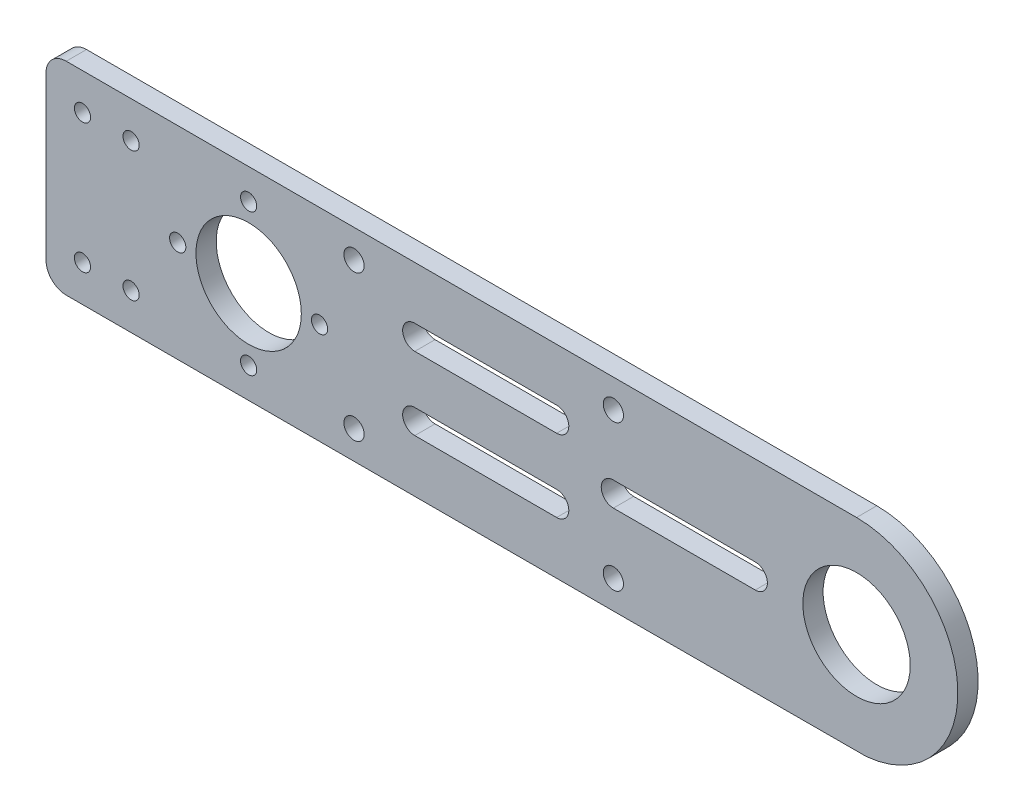
ISO-10303-21;
HEADER;
FILE_DESCRIPTION(('STEP AP214'),'2;1');
FILE_NAME('part.step','',(''),(''),'','','');
FILE_SCHEMA(('AUTOMOTIVE_DESIGN { 1 0 10303 214 1 1 1 1 }'));
ENDSEC;
DATA;
#1=APPLICATION_CONTEXT('core data for automotive mechanical design processes');
#2=APPLICATION_PROTOCOL_DEFINITION('international standard','automotive_design',2000,#1);
#3=PRODUCT_CONTEXT('',#1,'mechanical');
#4=PRODUCT('Part','Part','',(#3));
#5=PRODUCT_RELATED_PRODUCT_CATEGORY('part','',(#4));
#6=PRODUCT_DEFINITION_FORMATION('','',#4);
#7=PRODUCT_DEFINITION_CONTEXT('part definition',#1,'design');
#8=PRODUCT_DEFINITION('design','',#6,#7);
#9=PRODUCT_DEFINITION_SHAPE('','',#8);
#10=(LENGTH_UNIT() NAMED_UNIT(*) SI_UNIT(.MILLI.,.METRE.));
#11=(NAMED_UNIT(*) PLANE_ANGLE_UNIT() SI_UNIT($,.RADIAN.));
#12=(NAMED_UNIT(*) SI_UNIT($,.STERADIAN.) SOLID_ANGLE_UNIT());
#13=UNCERTAINTY_MEASURE_WITH_UNIT(LENGTH_MEASURE(1.E-05),#10,'distance_accuracy_value','');
#14=(GEOMETRIC_REPRESENTATION_CONTEXT(3) GLOBAL_UNCERTAINTY_ASSIGNED_CONTEXT((#13)) GLOBAL_UNIT_ASSIGNED_CONTEXT((#10,
#11,#12)) REPRESENTATION_CONTEXT('',''));
#15=CARTESIAN_POINT('',(0.,0.,0.));
#16=DIRECTION('',(0.,0.,1.));
#17=DIRECTION('',(1.,0.,0.));
#18=AXIS2_PLACEMENT_3D('',#15,#16,#17);
#19=CARTESIAN_POINT('',(184.,0.,5.));
#20=DIRECTION('',(0.,0.,1.));
#21=DIRECTION('',(1.,0.,0.));
#22=AXIS2_PLACEMENT_3D('',#19,#20,#21);
#23=PLANE('',#22);
#24=CARTESIAN_POINT('',(60.,18.,5.));
#25=DIRECTION('',(0.,0.,1.));
#26=DIRECTION('',(1.,0.,0.));
#27=AXIS2_PLACEMENT_3D('',#24,#25,#26);
#28=CIRCLE('',#27,2.50000000000001);
#29=CARTESIAN_POINT('',(62.5,18.,5.));
#30=VERTEX_POINT('',#29);
#31=EDGE_CURVE('E203',#30,#30,#28,.T.);
#32=ORIENTED_EDGE('',*,*,#31,.F.);
#33=EDGE_LOOP('',(#32));
#34=FACE_BOUND('',#33,.T.);
#35=CARTESIAN_POINT('',(16.5000000000002,0.,5.));
#36=DIRECTION('',(0.,0.,1.));
#37=DIRECTION('',(1.,0.,0.));
#38=AXIS2_PLACEMENT_3D('',#35,#36,#37);
#39=CIRCLE('',#38,2.);
#40=CARTESIAN_POINT('',(18.5000000000002,0.,5.));
#41=VERTEX_POINT('',#40);
#42=EDGE_CURVE('E220',#41,#41,#39,.T.);
#43=ORIENTED_EDGE('',*,*,#42,.F.);
#44=EDGE_LOOP('',(#43));
#45=FACE_BOUND('',#44,.T.);
#46=CARTESIAN_POINT('',(5.,16.,5.));
#47=DIRECTION('',(0.,0.,1.));
#48=DIRECTION('',(1.,0.,0.));
#49=AXIS2_PLACEMENT_3D('',#46,#47,#48);
#50=CIRCLE('',#49,2.);
#51=CARTESIAN_POINT('',(7.,16.,5.));
#52=VERTEX_POINT('',#51);
#53=EDGE_CURVE('E263',#52,#52,#50,.T.);
#54=ORIENTED_EDGE('',*,*,#53,.F.);
#55=EDGE_LOOP('',(#54));
#56=FACE_BOUND('',#55,.T.);
#57=DIRECTION('',(1.,0.,0.));
#58=VECTOR('',#57,1.);
#59=CARTESIAN_POINT('',(75.,-12.,5.));
#60=LINE('',#59,#58);
#61=CARTESIAN_POINT('',(75.,-12.,5.));
#62=VERTEX_POINT('',#61);
#63=CARTESIAN_POINT('',(110.,-12.,5.));
#64=VERTEX_POINT('',#63);
#65=EDGE_CURVE('E277',#62,#64,#60,.T.);
#66=ORIENTED_EDGE('',*,*,#65,.F.);
#67=CARTESIAN_POINT('',(75.,-9.,5.));
#68=DIRECTION('',(0.,0.,1.));
#69=DIRECTION('',(-1.,0.,0.));
#70=AXIS2_PLACEMENT_3D('',#67,#68,#69);
#71=CIRCLE('',#70,3.);
#72=CARTESIAN_POINT('',(75.,-6.,5.));
#73=VERTEX_POINT('',#72);
#74=EDGE_CURVE('E275',#73,#62,#71,.T.);
#75=ORIENTED_EDGE('',*,*,#74,.F.);
#76=DIRECTION('',(-1.,0.,0.));
#77=VECTOR('',#76,1.);
#78=CARTESIAN_POINT('',(75.,-6.,5.));
#79=LINE('',#78,#77);
#80=CARTESIAN_POINT('',(110.,-6.,5.));
#81=VERTEX_POINT('',#80);
#82=EDGE_CURVE('E283',#81,#73,#79,.T.);
#83=ORIENTED_EDGE('',*,*,#82,.F.);
#84=CARTESIAN_POINT('',(110.,-9.,5.));
#85=DIRECTION('',(0.,0.,1.));
#86=DIRECTION('',(-1.,0.,0.));
#87=AXIS2_PLACEMENT_3D('',#84,#85,#86);
#88=CIRCLE('',#87,3.);
#89=EDGE_CURVE('E280',#64,#81,#88,.T.);
#90=ORIENTED_EDGE('',*,*,#89,.F.);
#91=EDGE_LOOP('',(#66,#75,#83,#90));
#92=FACE_BOUND('',#91,.T.);
#93=CARTESIAN_POINT('',(60.,-18.,5.));
#94=DIRECTION('',(0.,0.,1.));
#95=DIRECTION('',(-1.,0.,0.));
#96=AXIS2_PLACEMENT_3D('',#93,#94,#95);
#97=CIRCLE('',#96,2.50000000000001);
#98=CARTESIAN_POINT('',(57.5,-18.,5.));
#99=VERTEX_POINT('',#98);
#100=EDGE_CURVE('E306',#99,#99,#97,.T.);
#101=ORIENTED_EDGE('',*,*,#100,.F.);
#102=EDGE_LOOP('',(#101));
#103=FACE_BOUND('',#102,.T.);
#104=CARTESIAN_POINT('',(51.5000000000002,1.80411241501588E-13,5.));
#105=DIRECTION('',(0.,0.,1.));
#106=DIRECTION('',(1.,0.,0.));
#107=AXIS2_PLACEMENT_3D('',#104,#105,#106);
#108=CIRCLE('',#107,2.);
#109=CARTESIAN_POINT('',(53.5000000000002,1.80411241501588E-13,5.));
#110=VERTEX_POINT('',#109);
#111=EDGE_CURVE('E318',#110,#110,#108,.T.);
#112=ORIENTED_EDGE('',*,*,#111,.F.);
#113=EDGE_LOOP('',(#112));
#114=FACE_BOUND('',#113,.T.);
#115=CARTESIAN_POINT('',(124.,-18.,5.));
#116=DIRECTION('',(0.,0.,1.));
#117=DIRECTION('',(-1.,0.,0.));
#118=AXIS2_PLACEMENT_3D('',#115,#116,#117);
#119=CIRCLE('',#118,2.5);
#120=CARTESIAN_POINT('',(121.5,-18.,5.));
#121=VERTEX_POINT('',#120);
#122=EDGE_CURVE('E330',#121,#121,#119,.T.);
#123=ORIENTED_EDGE('',*,*,#122,.F.);
#124=EDGE_LOOP('',(#123));
#125=FACE_BOUND('',#124,.T.);
#126=CARTESIAN_POINT('',(34.,0.,5.));
#127=DIRECTION('',(0.,0.,1.));
#128=DIRECTION('',(1.,0.,0.));
#129=AXIS2_PLACEMENT_3D('',#126,#127,#128);
#130=CIRCLE('',#129,13.);
#131=CARTESIAN_POINT('',(47.,0.,5.));
#132=VERTEX_POINT('',#131);
#133=EDGE_CURVE('E342',#132,#132,#130,.T.);
#134=ORIENTED_EDGE('',*,*,#133,.F.);
#135=EDGE_LOOP('',(#134));
#136=FACE_BOUND('',#135,.T.);
#137=DIRECTION('',(0.,-1.,0.));
#138=VECTOR('',#137,1.);
#139=CARTESIAN_POINT('',(-16.,25.,5.));
#140=LINE('',#139,#138);
#141=CARTESIAN_POINT('',(-16.,20.,5.));
#142=VERTEX_POINT('',#141);
#143=CARTESIAN_POINT('',(-16.,-20.,5.));
#144=VERTEX_POINT('',#143);
#145=EDGE_CURVE('E350',#142,#144,#140,.T.);
#146=ORIENTED_EDGE('',*,*,#145,.T.);
#147=CARTESIAN_POINT('',(-11.,-20.,5.));
#148=DIRECTION('',(0.,0.,1.));
#149=DIRECTION('',(1.,0.,0.));
#150=AXIS2_PLACEMENT_3D('',#147,#148,#149);
#151=CIRCLE('',#150,5.);
#152=CARTESIAN_POINT('',(-11.,-25.,5.));
#153=VERTEX_POINT('',#152);
#154=EDGE_CURVE('E45',#144,#153,#151,.T.);
#155=ORIENTED_EDGE('',*,*,#154,.T.);
#156=DIRECTION('',(1.,0.,0.));
#157=VECTOR('',#156,1.);
#158=CARTESIAN_POINT('',(-16.,-25.,5.));
#159=LINE('',#158,#157);
#160=CARTESIAN_POINT('',(124.869292100737,-25.,5.));
#161=VERTEX_POINT('',#160);
#162=EDGE_CURVE('E353',#153,#161,#159,.T.);
#163=ORIENTED_EDGE('',*,*,#162,.T.);
#164=DIRECTION('',(0.999997963583353,0.00201812515635357,0.));
#165=VECTOR('',#164,1.);
#166=CARTESIAN_POINT('',(124.869292100737,-25.,5.));
#167=LINE('',#166,#165);
#168=CARTESIAN_POINT('',(186.490484141799,-24.8756404689296,5.));
#169=VERTEX_POINT('',#168);
#170=EDGE_CURVE('E355',#161,#169,#167,.T.);
#171=ORIENTED_EDGE('',*,*,#170,.T.);
#172=CARTESIAN_POINT('',(184.,0.,5.));
#173=DIRECTION('',(0.,0.,1.));
#174=DIRECTION('',(1.,0.,0.));
#175=AXIS2_PLACEMENT_3D('',#172,#173,#174);
#176=CIRCLE('',#175,25.);
#177=CARTESIAN_POINT('',(184.,25.,5.));
#178=VERTEX_POINT('',#177);
#179=EDGE_CURVE('E357',#169,#178,#176,.T.);
#180=ORIENTED_EDGE('',*,*,#179,.T.);
#181=DIRECTION('',(-1.,0.,0.));
#182=VECTOR('',#181,1.);
#183=CARTESIAN_POINT('',(0.,25.,5.));
#184=LINE('',#183,#182);
#185=CARTESIAN_POINT('',(-11.,25.,5.));
#186=VERTEX_POINT('',#185);
#187=EDGE_CURVE('E348',#178,#186,#184,.T.);
#188=ORIENTED_EDGE('',*,*,#187,.T.);
#189=CARTESIAN_POINT('',(-11.,20.,5.));
#190=DIRECTION('',(0.,0.,1.));
#191=DIRECTION('',(1.,0.,0.));
#192=AXIS2_PLACEMENT_3D('',#189,#190,#191);
#193=CIRCLE('',#192,5.);
#194=EDGE_CURVE('E389',#186,#142,#193,.T.);
#195=ORIENTED_EDGE('',*,*,#194,.T.);
#196=EDGE_LOOP('',(#146,#155,#163,#171,#180,#188,#195));
#197=FACE_BOUND('',#196,.T.);
#198=CARTESIAN_POINT('',(34.,17.5,5.));
#199=DIRECTION('',(0.,0.,1.));
#200=DIRECTION('',(1.,0.,0.));
#201=AXIS2_PLACEMENT_3D('',#198,#199,#200);
#202=CIRCLE('',#201,2.);
#203=CARTESIAN_POINT('',(36.,17.5,5.));
#204=VERTEX_POINT('',#203);
#205=EDGE_CURVE('E336',#204,#204,#202,.T.);
#206=ORIENTED_EDGE('',*,*,#205,.F.);
#207=EDGE_LOOP('',(#206));
#208=FACE_BOUND('',#207,.T.);
#209=CARTESIAN_POINT('',(-7.,16.,5.));
#210=DIRECTION('',(0.,0.,1.));
#211=DIRECTION('',(1.,0.,0.));
#212=AXIS2_PLACEMENT_3D('',#209,#210,#211);
#213=CIRCLE('',#212,2.);
#214=CARTESIAN_POINT('',(-5.,16.,5.));
#215=VERTEX_POINT('',#214);
#216=EDGE_CURVE('E324',#215,#215,#213,.T.);
#217=ORIENTED_EDGE('',*,*,#216,.F.);
#218=EDGE_LOOP('',(#217));
#219=FACE_BOUND('',#218,.T.);
#220=CARTESIAN_POINT('',(184.,0.,5.));
#221=DIRECTION('',(0.,0.,1.));
#222=DIRECTION('',(1.,0.,0.));
#223=AXIS2_PLACEMENT_3D('',#220,#221,#222);
#224=CIRCLE('',#223,13.25);
#225=CARTESIAN_POINT('',(197.25,0.,5.));
#226=VERTEX_POINT('',#225);
#227=EDGE_CURVE('E312',#226,#226,#224,.T.);
#228=ORIENTED_EDGE('',*,*,#227,.F.);
#229=EDGE_LOOP('',(#228));
#230=FACE_BOUND('',#229,.T.);
#231=CARTESIAN_POINT('',(34.0000000000004,-17.5,5.));
#232=DIRECTION('',(0.,0.,1.));
#233=DIRECTION('',(1.,0.,0.));
#234=AXIS2_PLACEMENT_3D('',#231,#232,#233);
#235=CIRCLE('',#234,2.);
#236=CARTESIAN_POINT('',(36.0000000000004,-17.5,5.));
#237=VERTEX_POINT('',#236);
#238=EDGE_CURVE('E269',#237,#237,#235,.T.);
#239=ORIENTED_EDGE('',*,*,#238,.F.);
#240=EDGE_LOOP('',(#239));
#241=FACE_BOUND('',#240,.T.);
#242=CARTESIAN_POINT('',(5.,-16.,5.));
#243=DIRECTION('',(0.,0.,1.));
#244=DIRECTION('',(-1.,0.,0.));
#245=AXIS2_PLACEMENT_3D('',#242,#243,#244);
#246=CIRCLE('',#245,2.);
#247=CARTESIAN_POINT('',(3.,-16.,5.));
#248=VERTEX_POINT('',#247);
#249=EDGE_CURVE('E257',#248,#248,#246,.T.);
#250=ORIENTED_EDGE('',*,*,#249,.F.);
#251=EDGE_LOOP('',(#250));
#252=FACE_BOUND('',#251,.T.);
#253=DIRECTION('',(1.,0.,0.));
#254=VECTOR('',#253,1.);
#255=CARTESIAN_POINT('',(124.,-3.,5.));
#256=LINE('',#255,#254);
#257=CARTESIAN_POINT('',(124.,-3.,5.));
#258=VERTEX_POINT('',#257);
#259=CARTESIAN_POINT('',(159.,-3.,5.));
#260=VERTEX_POINT('',#259);
#261=EDGE_CURVE('E228',#258,#260,#256,.T.);
#262=ORIENTED_EDGE('',*,*,#261,.F.);
#263=CARTESIAN_POINT('',(124.,0.,5.));
#264=DIRECTION('',(0.,0.,1.));
#265=DIRECTION('',(1.,0.,0.));
#266=AXIS2_PLACEMENT_3D('',#263,#264,#265);
#267=CIRCLE('',#266,3.);
#268=CARTESIAN_POINT('',(124.,3.,5.));
#269=VERTEX_POINT('',#268);
#270=EDGE_CURVE('E226',#269,#258,#267,.T.);
#271=ORIENTED_EDGE('',*,*,#270,.F.);
#272=DIRECTION('',(-1.,0.,0.));
#273=VECTOR('',#272,1.);
#274=CARTESIAN_POINT('',(124.,3.,5.));
#275=LINE('',#274,#273);
#276=CARTESIAN_POINT('',(159.,3.,5.));
#277=VERTEX_POINT('',#276);
#278=EDGE_CURVE('E234',#277,#269,#275,.T.);
#279=ORIENTED_EDGE('',*,*,#278,.F.);
#280=CARTESIAN_POINT('',(159.,0.,5.));
#281=DIRECTION('',(0.,0.,1.));
#282=DIRECTION('',(1.,0.,0.));
#283=AXIS2_PLACEMENT_3D('',#280,#281,#282);
#284=CIRCLE('',#283,3.);
#285=EDGE_CURVE('E231',#260,#277,#284,.T.);
#286=ORIENTED_EDGE('',*,*,#285,.F.);
#287=EDGE_LOOP('',(#262,#271,#279,#286));
#288=FACE_BOUND('',#287,.T.);
#289=CARTESIAN_POINT('',(-7.,-16.,5.));
#290=DIRECTION('',(0.,0.,1.));
#291=DIRECTION('',(-1.,0.,0.));
#292=AXIS2_PLACEMENT_3D('',#289,#290,#291);
#293=CIRCLE('',#292,2.);
#294=CARTESIAN_POINT('',(-9.,-16.,5.));
#295=VERTEX_POINT('',#294);
#296=EDGE_CURVE('E214',#295,#295,#293,.T.);
#297=ORIENTED_EDGE('',*,*,#296,.F.);
#298=EDGE_LOOP('',(#297));
#299=FACE_BOUND('',#298,.T.);
#300=DIRECTION('',(1.,0.,0.));
#301=VECTOR('',#300,1.);
#302=CARTESIAN_POINT('',(75.,6.,5.));
#303=LINE('',#302,#301);
#304=CARTESIAN_POINT('',(75.,6.,5.));
#305=VERTEX_POINT('',#304);
#306=CARTESIAN_POINT('',(110.,6.,5.));
#307=VERTEX_POINT('',#306);
#308=EDGE_CURVE('E180',#305,#307,#303,.T.);
#309=ORIENTED_EDGE('',*,*,#308,.F.);
#310=CARTESIAN_POINT('',(75.,9.,5.));
#311=DIRECTION('',(0.,0.,1.));
#312=DIRECTION('',(1.,0.,0.));
#313=AXIS2_PLACEMENT_3D('',#310,#311,#312);
#314=CIRCLE('',#313,3.);
#315=CARTESIAN_POINT('',(75.,12.,5.));
#316=VERTEX_POINT('',#315);
#317=EDGE_CURVE('E170',#316,#305,#314,.T.);
#318=ORIENTED_EDGE('',*,*,#317,.F.);
#319=DIRECTION('',(-1.,0.,0.));
#320=VECTOR('',#319,1.);
#321=CARTESIAN_POINT('',(75.,12.,5.));
#322=LINE('',#321,#320);
#323=CARTESIAN_POINT('',(110.,12.,5.));
#324=VERTEX_POINT('',#323);
#325=EDGE_CURVE('E196',#324,#316,#322,.T.);
#326=ORIENTED_EDGE('',*,*,#325,.F.);
#327=CARTESIAN_POINT('',(110.,9.,5.));
#328=DIRECTION('',(0.,0.,1.));
#329=DIRECTION('',(1.,0.,0.));
#330=AXIS2_PLACEMENT_3D('',#327,#328,#329);
#331=CIRCLE('',#330,3.);
#332=EDGE_CURVE('E194',#307,#324,#331,.T.);
#333=ORIENTED_EDGE('',*,*,#332,.F.);
#334=EDGE_LOOP('',(#309,#318,#326,#333));
#335=FACE_BOUND('',#334,.T.);
#336=CARTESIAN_POINT('',(124.,18.,5.));
#337=DIRECTION('',(0.,0.,1.));
#338=DIRECTION('',(1.,0.,0.));
#339=AXIS2_PLACEMENT_3D('',#336,#337,#338);
#340=CIRCLE('',#339,2.5);
#341=CARTESIAN_POINT('',(126.5,18.,5.));
#342=VERTEX_POINT('',#341);
#343=EDGE_CURVE('E558',#342,#342,#340,.T.);
#344=ORIENTED_EDGE('',*,*,#343,.F.);
#345=EDGE_LOOP('',(#344));
#346=FACE_BOUND('',#345,.T.);
#347=ADVANCED_FACE('F37',(#34,#45,#56,#92,#103,#114,#125,#136,#197,#208,#219,#230,#241,#252,
#288,#299,#335,#346),#23,.T.);
#348=CARTESIAN_POINT('',(184.,0.,0.));
#349=DIRECTION('',(0.,0.,1.));
#350=DIRECTION('',(1.,0.,0.));
#351=AXIS2_PLACEMENT_3D('',#348,#349,#350);
#352=PLANE('',#351);
#353=CARTESIAN_POINT('',(-7.,-16.,0.));
#354=DIRECTION('',(0.,0.,1.));
#355=DIRECTION('',(-1.,0.,0.));
#356=AXIS2_PLACEMENT_3D('',#353,#354,#355);
#357=CIRCLE('',#356,2.);
#358=CARTESIAN_POINT('',(-9.,-16.,0.));
#359=VERTEX_POINT('',#358);
#360=EDGE_CURVE('E188',#359,#359,#357,.T.);
#361=ORIENTED_EDGE('',*,*,#360,.T.);
#362=EDGE_LOOP('',(#361));
#363=FACE_BOUND('',#362,.T.);
#364=CARTESIAN_POINT('',(16.5000000000002,0.,0.));
#365=DIRECTION('',(0.,0.,1.));
#366=DIRECTION('',(1.,0.,0.));
#367=AXIS2_PLACEMENT_3D('',#364,#365,#366);
#368=CIRCLE('',#367,2.);
#369=CARTESIAN_POINT('',(18.5000000000002,0.,0.));
#370=VERTEX_POINT('',#369);
#371=EDGE_CURVE('E217',#370,#370,#368,.T.);
#372=ORIENTED_EDGE('',*,*,#371,.T.);
#373=EDGE_LOOP('',(#372));
#374=FACE_BOUND('',#373,.T.);
#375=CARTESIAN_POINT('',(124.,0.,0.));
#376=DIRECTION('',(0.,0.,1.));
#377=DIRECTION('',(1.,0.,0.));
#378=AXIS2_PLACEMENT_3D('',#375,#376,#377);
#379=CIRCLE('',#378,3.);
#380=CARTESIAN_POINT('',(124.,3.,0.));
#381=VERTEX_POINT('',#380);
#382=CARTESIAN_POINT('',(124.,-3.,0.));
#383=VERTEX_POINT('',#382);
#384=EDGE_CURVE('E223',#381,#383,#379,.T.);
#385=ORIENTED_EDGE('',*,*,#384,.T.);
#386=DIRECTION('',(1.,0.,0.));
#387=VECTOR('',#386,1.);
#388=CARTESIAN_POINT('',(124.,-3.,0.));
#389=LINE('',#388,#387);
#390=CARTESIAN_POINT('',(159.,-3.,0.));
#391=VERTEX_POINT('',#390);
#392=EDGE_CURVE('E239',#383,#391,#389,.T.);
#393=ORIENTED_EDGE('',*,*,#392,.T.);
#394=CARTESIAN_POINT('',(159.,0.,0.));
#395=DIRECTION('',(0.,0.,1.));
#396=DIRECTION('',(1.,0.,0.));
#397=AXIS2_PLACEMENT_3D('',#394,#395,#396);
#398=CIRCLE('',#397,3.);
#399=CARTESIAN_POINT('',(159.,3.,0.));
#400=VERTEX_POINT('',#399);
#401=EDGE_CURVE('E242',#391,#400,#398,.T.);
#402=ORIENTED_EDGE('',*,*,#401,.T.);
#403=DIRECTION('',(-1.,0.,0.));
#404=VECTOR('',#403,1.);
#405=CARTESIAN_POINT('',(124.,3.,0.));
#406=LINE('',#405,#404);
#407=EDGE_CURVE('E229',#400,#381,#406,.T.);
#408=ORIENTED_EDGE('',*,*,#407,.T.);
#409=EDGE_LOOP('',(#385,#393,#402,#408));
#410=FACE_BOUND('',#409,.T.);
#411=CARTESIAN_POINT('',(60.,-18.,0.));
#412=DIRECTION('',(0.,0.,1.));
#413=DIRECTION('',(-1.,0.,0.));
#414=AXIS2_PLACEMENT_3D('',#411,#412,#413);
#415=CIRCLE('',#414,2.50000000000001);
#416=CARTESIAN_POINT('',(57.5,-18.,0.));
#417=VERTEX_POINT('',#416);
#418=EDGE_CURVE('E305',#417,#417,#415,.T.);
#419=ORIENTED_EDGE('',*,*,#418,.T.);
#420=EDGE_LOOP('',(#419));
#421=FACE_BOUND('',#420,.T.);
#422=CARTESIAN_POINT('',(184.,0.,0.));
#423=DIRECTION('',(0.,0.,1.));
#424=DIRECTION('',(1.,0.,0.));
#425=AXIS2_PLACEMENT_3D('',#422,#423,#424);
#426=CIRCLE('',#425,13.25);
#427=CARTESIAN_POINT('',(197.25,0.,0.));
#428=VERTEX_POINT('',#427);
#429=EDGE_CURVE('E309',#428,#428,#426,.T.);
#430=ORIENTED_EDGE('',*,*,#429,.T.);
#431=EDGE_LOOP('',(#430));
#432=FACE_BOUND('',#431,.T.);
#433=CARTESIAN_POINT('',(51.5000000000002,1.80411241501588E-13,0.));
#434=DIRECTION('',(0.,0.,1.));
#435=DIRECTION('',(1.,0.,0.));
#436=AXIS2_PLACEMENT_3D('',#433,#434,#435);
#437=CIRCLE('',#436,2.);
#438=CARTESIAN_POINT('',(53.5000000000002,1.80411241501588E-13,0.));
#439=VERTEX_POINT('',#438);
#440=EDGE_CURVE('E315',#439,#439,#437,.T.);
#441=ORIENTED_EDGE('',*,*,#440,.T.);
#442=EDGE_LOOP('',(#441));
#443=FACE_BOUND('',#442,.T.);
#444=CARTESIAN_POINT('',(-7.,16.,0.));
#445=DIRECTION('',(0.,0.,1.));
#446=DIRECTION('',(1.,0.,0.));
#447=AXIS2_PLACEMENT_3D('',#444,#445,#446);
#448=CIRCLE('',#447,2.);
#449=CARTESIAN_POINT('',(-5.,16.,0.));
#450=VERTEX_POINT('',#449);
#451=EDGE_CURVE('E321',#450,#450,#448,.T.);
#452=ORIENTED_EDGE('',*,*,#451,.T.);
#453=EDGE_LOOP('',(#452));
#454=FACE_BOUND('',#453,.T.);
#455=CARTESIAN_POINT('',(124.,-18.,0.));
#456=DIRECTION('',(0.,0.,1.));
#457=DIRECTION('',(-1.,0.,0.));
#458=AXIS2_PLACEMENT_3D('',#455,#456,#457);
#459=CIRCLE('',#458,2.5);
#460=CARTESIAN_POINT('',(121.5,-18.,0.));
#461=VERTEX_POINT('',#460);
#462=EDGE_CURVE('E327',#461,#461,#459,.T.);
#463=ORIENTED_EDGE('',*,*,#462,.T.);
#464=EDGE_LOOP('',(#463));
#465=FACE_BOUND('',#464,.T.);
#466=CARTESIAN_POINT('',(34.,17.5,0.));
#467=DIRECTION('',(0.,0.,1.));
#468=DIRECTION('',(1.,0.,0.));
#469=AXIS2_PLACEMENT_3D('',#466,#467,#468);
#470=CIRCLE('',#469,2.);
#471=CARTESIAN_POINT('',(36.,17.5,0.));
#472=VERTEX_POINT('',#471);
#473=EDGE_CURVE('E333',#472,#472,#470,.T.);
#474=ORIENTED_EDGE('',*,*,#473,.T.);
#475=EDGE_LOOP('',(#474));
#476=FACE_BOUND('',#475,.T.);
#477=CARTESIAN_POINT('',(34.,0.,0.));
#478=DIRECTION('',(0.,0.,1.));
#479=DIRECTION('',(1.,0.,0.));
#480=AXIS2_PLACEMENT_3D('',#477,#478,#479);
#481=CIRCLE('',#480,13.);
#482=CARTESIAN_POINT('',(47.,0.,0.));
#483=VERTEX_POINT('',#482);
#484=EDGE_CURVE('E339',#483,#483,#481,.T.);
#485=ORIENTED_EDGE('',*,*,#484,.T.);
#486=EDGE_LOOP('',(#485));
#487=FACE_BOUND('',#486,.T.);
#488=DIRECTION('',(1.,0.,0.));
#489=VECTOR('',#488,1.);
#490=CARTESIAN_POINT('',(0.,-25.,0.));
#491=LINE('',#490,#489);
#492=CARTESIAN_POINT('',(-11.,-25.,0.));
#493=VERTEX_POINT('',#492);
#494=CARTESIAN_POINT('',(124.869292100737,-25.,0.));
#495=VERTEX_POINT('',#494);
#496=EDGE_CURVE('E362',#493,#495,#491,.T.);
#497=ORIENTED_EDGE('',*,*,#496,.F.);
#498=CARTESIAN_POINT('',(-11.,-20.,0.));
#499=DIRECTION('',(0.,0.,1.));
#500=DIRECTION('',(1.,0.,0.));
#501=AXIS2_PLACEMENT_3D('',#498,#499,#500);
#502=CIRCLE('',#501,5.);
#503=CARTESIAN_POINT('',(-16.,-20.,0.));
#504=VERTEX_POINT('',#503);
#505=EDGE_CURVE('E383',#493,#504,#502,.F.);
#506=ORIENTED_EDGE('',*,*,#505,.T.);
#507=DIRECTION('',(0.,-1.,0.));
#508=VECTOR('',#507,1.);
#509=CARTESIAN_POINT('',(-16.,25.,0.));
#510=LINE('',#509,#508);
#511=CARTESIAN_POINT('',(-16.,20.,0.));
#512=VERTEX_POINT('',#511);
#513=EDGE_CURVE('E345',#512,#504,#510,.T.);
#514=ORIENTED_EDGE('',*,*,#513,.F.);
#515=CARTESIAN_POINT('',(-11.,20.,0.));
#516=DIRECTION('',(0.,0.,1.));
#517=DIRECTION('',(1.,0.,0.));
#518=AXIS2_PLACEMENT_3D('',#515,#516,#517);
#519=CIRCLE('',#518,5.);
#520=CARTESIAN_POINT('',(-11.,25.,0.));
#521=VERTEX_POINT('',#520);
#522=EDGE_CURVE('E381',#512,#521,#519,.F.);
#523=ORIENTED_EDGE('',*,*,#522,.T.);
#524=DIRECTION('',(-1.,0.,0.));
#525=VECTOR('',#524,1.);
#526=CARTESIAN_POINT('',(0.,25.,0.));
#527=LINE('',#526,#525);
#528=CARTESIAN_POINT('',(184.,25.,0.));
#529=VERTEX_POINT('',#528);
#530=EDGE_CURVE('E351',#529,#521,#527,.T.);
#531=ORIENTED_EDGE('',*,*,#530,.F.);
#532=CARTESIAN_POINT('',(184.,0.,0.));
#533=DIRECTION('',(0.,0.,1.));
#534=DIRECTION('',(1.,0.,0.));
#535=AXIS2_PLACEMENT_3D('',#532,#533,#534);
#536=CIRCLE('',#535,25.);
#537=CARTESIAN_POINT('',(186.490484141799,-24.8756404689296,0.));
#538=VERTEX_POINT('',#537);
#539=EDGE_CURVE('E366',#538,#529,#536,.T.);
#540=ORIENTED_EDGE('',*,*,#539,.F.);
#541=DIRECTION('',(0.999997963583353,0.00201812515635357,0.));
#542=VECTOR('',#541,1.);
#543=CARTESIAN_POINT('',(124.869292100737,-25.,0.));
#544=LINE('',#543,#542);
#545=EDGE_CURVE('E364',#495,#538,#544,.T.);
#546=ORIENTED_EDGE('',*,*,#545,.F.);
#547=EDGE_LOOP('',(#497,#506,#514,#523,#531,#540,#546));
#548=FACE_BOUND('',#547,.T.);
#549=CARTESIAN_POINT('',(75.,-9.,0.));
#550=DIRECTION('',(0.,0.,1.));
#551=DIRECTION('',(-1.,0.,0.));
#552=AXIS2_PLACEMENT_3D('',#549,#550,#551);
#553=CIRCLE('',#552,3.);
#554=CARTESIAN_POINT('',(75.,-6.,0.));
#555=VERTEX_POINT('',#554);
#556=CARTESIAN_POINT('',(75.,-12.,0.));
#557=VERTEX_POINT('',#556);
#558=EDGE_CURVE('E272',#555,#557,#553,.T.);
#559=ORIENTED_EDGE('',*,*,#558,.T.);
#560=DIRECTION('',(1.,0.,0.));
#561=VECTOR('',#560,1.);
#562=CARTESIAN_POINT('',(75.,-12.,0.));
#563=LINE('',#562,#561);
#564=CARTESIAN_POINT('',(110.,-12.,0.));
#565=VERTEX_POINT('',#564);
#566=EDGE_CURVE('E288',#557,#565,#563,.T.);
#567=ORIENTED_EDGE('',*,*,#566,.T.);
#568=CARTESIAN_POINT('',(110.,-9.,0.));
#569=DIRECTION('',(0.,0.,1.));
#570=DIRECTION('',(-1.,0.,0.));
#571=AXIS2_PLACEMENT_3D('',#568,#569,#570);
#572=CIRCLE('',#571,3.);
#573=CARTESIAN_POINT('',(110.,-6.,0.));
#574=VERTEX_POINT('',#573);
#575=EDGE_CURVE('E291',#565,#574,#572,.T.);
#576=ORIENTED_EDGE('',*,*,#575,.T.);
#577=DIRECTION('',(-1.,0.,0.));
#578=VECTOR('',#577,1.);
#579=CARTESIAN_POINT('',(75.,-6.,0.));
#580=LINE('',#579,#578);
#581=EDGE_CURVE('E278',#574,#555,#580,.T.);
#582=ORIENTED_EDGE('',*,*,#581,.T.);
#583=EDGE_LOOP('',(#559,#567,#576,#582));
#584=FACE_BOUND('',#583,.T.);
#585=CARTESIAN_POINT('',(34.0000000000004,-17.5,0.));
#586=DIRECTION('',(0.,0.,1.));
#587=DIRECTION('',(1.,0.,0.));
#588=AXIS2_PLACEMENT_3D('',#585,#586,#587);
#589=CIRCLE('',#588,2.);
#590=CARTESIAN_POINT('',(36.0000000000004,-17.5,0.));
#591=VERTEX_POINT('',#590);
#592=EDGE_CURVE('E266',#591,#591,#589,.T.);
#593=ORIENTED_EDGE('',*,*,#592,.T.);
#594=EDGE_LOOP('',(#593));
#595=FACE_BOUND('',#594,.T.);
#596=CARTESIAN_POINT('',(5.,16.,0.));
#597=DIRECTION('',(0.,0.,1.));
#598=DIRECTION('',(1.,0.,0.));
#599=AXIS2_PLACEMENT_3D('',#596,#597,#598);
#600=CIRCLE('',#599,2.);
#601=CARTESIAN_POINT('',(7.,16.,0.));
#602=VERTEX_POINT('',#601);
#603=EDGE_CURVE('E260',#602,#602,#600,.T.);
#604=ORIENTED_EDGE('',*,*,#603,.T.);
#605=EDGE_LOOP('',(#604));
#606=FACE_BOUND('',#605,.T.);
#607=CARTESIAN_POINT('',(5.,-16.,0.));
#608=DIRECTION('',(0.,0.,1.));
#609=DIRECTION('',(-1.,0.,0.));
#610=AXIS2_PLACEMENT_3D('',#607,#608,#609);
#611=CIRCLE('',#610,2.);
#612=CARTESIAN_POINT('',(3.,-16.,0.));
#613=VERTEX_POINT('',#612);
#614=EDGE_CURVE('E256',#613,#613,#611,.T.);
#615=ORIENTED_EDGE('',*,*,#614,.T.);
#616=EDGE_LOOP('',(#615));
#617=FACE_BOUND('',#616,.T.);
#618=CARTESIAN_POINT('',(75.,9.,0.));
#619=DIRECTION('',(0.,0.,1.));
#620=DIRECTION('',(1.,0.,0.));
#621=AXIS2_PLACEMENT_3D('',#618,#619,#620);
#622=CIRCLE('',#621,3.);
#623=CARTESIAN_POINT('',(75.,12.,0.));
#624=VERTEX_POINT('',#623);
#625=CARTESIAN_POINT('',(75.,6.,0.));
#626=VERTEX_POINT('',#625);
#627=EDGE_CURVE('E201',#624,#626,#622,.T.);
#628=ORIENTED_EDGE('',*,*,#627,.T.);
#629=DIRECTION('',(1.,0.,0.));
#630=VECTOR('',#629,1.);
#631=CARTESIAN_POINT('',(75.,6.,0.));
#632=LINE('',#631,#630);
#633=CARTESIAN_POINT('',(110.,6.,0.));
#634=VERTEX_POINT('',#633);
#635=EDGE_CURVE('E187',#626,#634,#632,.T.);
#636=ORIENTED_EDGE('',*,*,#635,.T.);
#637=CARTESIAN_POINT('',(110.,9.,0.));
#638=DIRECTION('',(0.,0.,1.));
#639=DIRECTION('',(1.,0.,0.));
#640=AXIS2_PLACEMENT_3D('',#637,#638,#639);
#641=CIRCLE('',#640,3.);
#642=CARTESIAN_POINT('',(110.,12.,0.));
#643=VERTEX_POINT('',#642);
#644=EDGE_CURVE('E205',#634,#643,#641,.T.);
#645=ORIENTED_EDGE('',*,*,#644,.T.);
#646=DIRECTION('',(-1.,0.,0.));
#647=VECTOR('',#646,1.);
#648=CARTESIAN_POINT('',(75.,12.,0.));
#649=LINE('',#648,#647);
#650=EDGE_CURVE('E181',#643,#624,#649,.T.);
#651=ORIENTED_EDGE('',*,*,#650,.T.);
#652=EDGE_LOOP('',(#628,#636,#645,#651));
#653=FACE_BOUND('',#652,.T.);
#654=CARTESIAN_POINT('',(60.,18.,0.));
#655=DIRECTION('',(0.,0.,1.));
#656=DIRECTION('',(1.,0.,0.));
#657=AXIS2_PLACEMENT_3D('',#654,#655,#656);
#658=CIRCLE('',#657,2.50000000000001);
#659=CARTESIAN_POINT('',(62.5,18.,0.));
#660=VERTEX_POINT('',#659);
#661=EDGE_CURVE('E564',#660,#660,#658,.T.);
#662=ORIENTED_EDGE('',*,*,#661,.T.);
#663=EDGE_LOOP('',(#662));
#664=FACE_BOUND('',#663,.T.);
#665=CARTESIAN_POINT('',(124.,18.,0.));
#666=DIRECTION('',(0.,0.,1.));
#667=DIRECTION('',(1.,0.,0.));
#668=AXIS2_PLACEMENT_3D('',#665,#666,#667);
#669=CIRCLE('',#668,2.5);
#670=CARTESIAN_POINT('',(126.5,18.,0.));
#671=VERTEX_POINT('',#670);
#672=EDGE_CURVE('E561',#671,#671,#669,.T.);
#673=ORIENTED_EDGE('',*,*,#672,.T.);
#674=EDGE_LOOP('',(#673));
#675=FACE_BOUND('',#674,.T.);
#676=ADVANCED_FACE('F404',(#363,#374,#410,#421,#432,#443,#454,#465,#476,#487,#548,#584,#595,
#606,#617,#653,#664,#675),#352,.F.);
#677=CARTESIAN_POINT('',(-16.,25.,5.));
#678=DIRECTION('',(1.,0.,0.));
#679=DIRECTION('',(0.,1.,0.));
#680=AXIS2_PLACEMENT_3D('',#677,#678,#679);
#681=PLANE('',#680);
#682=ORIENTED_EDGE('',*,*,#513,.T.);
#683=DIRECTION('',(0.,0.,-1.));
#684=VECTOR('',#683,1.);
#685=CARTESIAN_POINT('',(-16.,-20.,5.));
#686=LINE('',#685,#684);
#687=EDGE_CURVE('E58',#504,#144,#686,.F.);
#688=ORIENTED_EDGE('',*,*,#687,.T.);
#689=ORIENTED_EDGE('',*,*,#145,.F.);
#690=DIRECTION('',(0.,0.,-1.));
#691=VECTOR('',#690,1.);
#692=CARTESIAN_POINT('',(-16.,20.,5.));
#693=LINE('',#692,#691);
#694=EDGE_CURVE('E385',#142,#512,#693,.T.);
#695=ORIENTED_EDGE('',*,*,#694,.T.);
#696=EDGE_LOOP('',(#682,#688,#689,#695));
#697=FACE_BOUND('',#696,.T.);
#698=ADVANCED_FACE('F407',(#697),#681,.F.);
#699=CARTESIAN_POINT('',(0.,-25.,5.));
#700=DIRECTION('',(0.,1.,0.));
#701=DIRECTION('',(0.,0.,1.));
#702=AXIS2_PLACEMENT_3D('',#699,#700,#701);
#703=PLANE('',#702);
#704=ORIENTED_EDGE('',*,*,#162,.F.);
#705=DIRECTION('',(0.,0.,-1.));
#706=VECTOR('',#705,1.);
#707=CARTESIAN_POINT('',(-11.,-25.,5.));
#708=LINE('',#707,#706);
#709=EDGE_CURVE('E378',#153,#493,#708,.T.);
#710=ORIENTED_EDGE('',*,*,#709,.T.);
#711=ORIENTED_EDGE('',*,*,#496,.T.);
#712=DIRECTION('',(0.,0.,-1.));
#713=VECTOR('',#712,1.);
#714=CARTESIAN_POINT('',(124.869292100737,-25.,5.));
#715=LINE('',#714,#713);
#716=EDGE_CURVE('E375',#161,#495,#715,.T.);
#717=ORIENTED_EDGE('',*,*,#716,.F.);
#718=EDGE_LOOP('',(#704,#710,#711,#717));
#719=FACE_BOUND('',#718,.T.);
#720=ADVANCED_FACE('F398',(#719),#703,.F.);
#721=CARTESIAN_POINT('',(124.869292100737,-25.,5.));
#722=DIRECTION('',(-0.00201812515635357,0.999997963583353,0.));
#723=DIRECTION('',(-0.999997963583353,-0.00201812515635357,0.));
#724=AXIS2_PLACEMENT_3D('',#721,#722,#723);
#725=PLANE('',#724);
#726=ORIENTED_EDGE('',*,*,#545,.T.);
#727=DIRECTION('',(0.,0.,-1.));
#728=VECTOR('',#727,1.);
#729=CARTESIAN_POINT('',(186.490484141799,-24.8756404689296,5.));
#730=LINE('',#729,#728);
#731=EDGE_CURVE('E372',#169,#538,#730,.T.);
#732=ORIENTED_EDGE('',*,*,#731,.F.);
#733=ORIENTED_EDGE('',*,*,#170,.F.);
#734=ORIENTED_EDGE('',*,*,#716,.T.);
#735=EDGE_LOOP('',(#726,#732,#733,#734));
#736=FACE_BOUND('',#735,.T.);
#737=ADVANCED_FACE('F419',(#736),#725,.F.);
#738=CARTESIAN_POINT('',(184.,0.,5.));
#739=DIRECTION('',(0.,0.,-1.));
#740=DIRECTION('',(-1.,0.,0.));
#741=AXIS2_PLACEMENT_3D('',#738,#739,#740);
#742=CYLINDRICAL_SURFACE('',#741,25.);
#743=ORIENTED_EDGE('',*,*,#539,.T.);
#744=DIRECTION('',(0.,0.,-1.));
#745=VECTOR('',#744,1.);
#746=CARTESIAN_POINT('',(184.,25.,5.));
#747=LINE('',#746,#745);
#748=EDGE_CURVE('E360',#178,#529,#747,.T.);
#749=ORIENTED_EDGE('',*,*,#748,.F.);
#750=ORIENTED_EDGE('',*,*,#179,.F.);
#751=ORIENTED_EDGE('',*,*,#731,.T.);
#752=EDGE_LOOP('',(#743,#749,#750,#751));
#753=FACE_BOUND('',#752,.T.);
#754=ADVANCED_FACE('F416',(#753),#742,.T.);
#755=CARTESIAN_POINT('',(0.,25.,5.));
#756=DIRECTION('',(0.,-1.,0.));
#757=DIRECTION('',(0.,0.,-1.));
#758=AXIS2_PLACEMENT_3D('',#755,#756,#757);
#759=PLANE('',#758);
#760=ORIENTED_EDGE('',*,*,#530,.T.);
#761=DIRECTION('',(0.,0.,-1.));
#762=VECTOR('',#761,1.);
#763=CARTESIAN_POINT('',(-11.,25.,5.));
#764=LINE('',#763,#762);
#765=EDGE_CURVE('E11',#521,#186,#764,.F.);
#766=ORIENTED_EDGE('',*,*,#765,.T.);
#767=ORIENTED_EDGE('',*,*,#187,.F.);
#768=ORIENTED_EDGE('',*,*,#748,.T.);
#769=EDGE_LOOP('',(#760,#766,#767,#768));
#770=FACE_BOUND('',#769,.T.);
#771=ADVANCED_FACE('F412',(#770),#759,.F.);
#772=CARTESIAN_POINT('',(34.,0.,5.));
#773=DIRECTION('',(0.,0.,-1.));
#774=DIRECTION('',(-1.,0.,0.));
#775=AXIS2_PLACEMENT_3D('',#772,#773,#774);
#776=CYLINDRICAL_SURFACE('',#775,13.);
#777=ORIENTED_EDGE('',*,*,#133,.T.);
#778=EDGE_LOOP('',(#777));
#779=FACE_BOUND('',#778,.T.);
#780=ORIENTED_EDGE('',*,*,#484,.F.);
#781=EDGE_LOOP('',(#780));
#782=FACE_BOUND('',#781,.T.);
#783=ADVANCED_FACE('F439',(#779,#782),#776,.F.);
#784=CARTESIAN_POINT('',(34.,17.5,5.));
#785=DIRECTION('',(0.,0.,-1.));
#786=DIRECTION('',(-1.,0.,0.));
#787=AXIS2_PLACEMENT_3D('',#784,#785,#786);
#788=CYLINDRICAL_SURFACE('',#787,2.);
#789=ORIENTED_EDGE('',*,*,#205,.T.);
#790=EDGE_LOOP('',(#789));
#791=FACE_BOUND('',#790,.T.);
#792=ORIENTED_EDGE('',*,*,#473,.F.);
#793=EDGE_LOOP('',(#792));
#794=FACE_BOUND('',#793,.T.);
#795=ADVANCED_FACE('F446',(#791,#794),#788,.F.);
#796=CARTESIAN_POINT('',(124.,-18.,5.));
#797=DIRECTION('',(0.,0.,-1.));
#798=DIRECTION('',(-1.,0.,0.));
#799=AXIS2_PLACEMENT_3D('',#796,#797,#798);
#800=CYLINDRICAL_SURFACE('',#799,2.5);
#801=ORIENTED_EDGE('',*,*,#122,.T.);
#802=EDGE_LOOP('',(#801));
#803=FACE_BOUND('',#802,.T.);
#804=ORIENTED_EDGE('',*,*,#462,.F.);
#805=EDGE_LOOP('',(#804));
#806=FACE_BOUND('',#805,.T.);
#807=ADVANCED_FACE('F451',(#803,#806),#800,.F.);
#808=CARTESIAN_POINT('',(-7.,16.,5.));
#809=DIRECTION('',(0.,0.,-1.));
#810=DIRECTION('',(-1.,0.,0.));
#811=AXIS2_PLACEMENT_3D('',#808,#809,#810);
#812=CYLINDRICAL_SURFACE('',#811,2.);
#813=ORIENTED_EDGE('',*,*,#216,.T.);
#814=EDGE_LOOP('',(#813));
#815=FACE_BOUND('',#814,.T.);
#816=ORIENTED_EDGE('',*,*,#451,.F.);
#817=EDGE_LOOP('',(#816));
#818=FACE_BOUND('',#817,.T.);
#819=ADVANCED_FACE('F461',(#815,#818),#812,.F.);
#820=CARTESIAN_POINT('',(51.5000000000002,1.80411241501588E-13,5.));
#821=DIRECTION('',(0.,0.,-1.));
#822=DIRECTION('',(-1.,0.,0.));
#823=AXIS2_PLACEMENT_3D('',#820,#821,#822);
#824=CYLINDRICAL_SURFACE('',#823,2.);
#825=ORIENTED_EDGE('',*,*,#111,.T.);
#826=EDGE_LOOP('',(#825));
#827=FACE_BOUND('',#826,.T.);
#828=ORIENTED_EDGE('',*,*,#440,.F.);
#829=EDGE_LOOP('',(#828));
#830=FACE_BOUND('',#829,.T.);
#831=ADVANCED_FACE('F468',(#827,#830),#824,.F.);
#832=CARTESIAN_POINT('',(184.,0.,5.));
#833=DIRECTION('',(0.,0.,-1.));
#834=DIRECTION('',(-1.,0.,0.));
#835=AXIS2_PLACEMENT_3D('',#832,#833,#834);
#836=CYLINDRICAL_SURFACE('',#835,13.25);
#837=ORIENTED_EDGE('',*,*,#227,.T.);
#838=EDGE_LOOP('',(#837));
#839=FACE_BOUND('',#838,.T.);
#840=ORIENTED_EDGE('',*,*,#429,.F.);
#841=EDGE_LOOP('',(#840));
#842=FACE_BOUND('',#841,.T.);
#843=ADVANCED_FACE('F472',(#839,#842),#836,.F.);
#844=CARTESIAN_POINT('',(60.,-18.,5.));
#845=DIRECTION('',(0.,0.,-1.));
#846=DIRECTION('',(-1.,0.,0.));
#847=AXIS2_PLACEMENT_3D('',#844,#845,#846);
#848=CYLINDRICAL_SURFACE('',#847,2.50000000000001);
#849=ORIENTED_EDGE('',*,*,#100,.T.);
#850=EDGE_LOOP('',(#849));
#851=FACE_BOUND('',#850,.T.);
#852=ORIENTED_EDGE('',*,*,#418,.F.);
#853=EDGE_LOOP('',(#852));
#854=FACE_BOUND('',#853,.T.);
#855=ADVANCED_FACE('F476',(#851,#854),#848,.F.);
#856=CARTESIAN_POINT('',(75.,-9.,5.));
#857=DIRECTION('',(0.,0.,-1.));
#858=DIRECTION('',(-1.,0.,0.));
#859=AXIS2_PLACEMENT_3D('',#856,#857,#858);
#860=CYLINDRICAL_SURFACE('',#859,3.);
#861=ORIENTED_EDGE('',*,*,#558,.F.);
#862=DIRECTION('',(0.,0.,-1.));
#863=VECTOR('',#862,1.);
#864=CARTESIAN_POINT('',(75.,-6.,5.));
#865=LINE('',#864,#863);
#866=EDGE_CURVE('E285',#73,#555,#865,.T.);
#867=ORIENTED_EDGE('',*,*,#866,.F.);
#868=ORIENTED_EDGE('',*,*,#74,.T.);
#869=DIRECTION('',(0.,0.,-1.));
#870=VECTOR('',#869,1.);
#871=CARTESIAN_POINT('',(75.,-12.,5.));
#872=LINE('',#871,#870);
#873=EDGE_CURVE('E302',#62,#557,#872,.T.);
#874=ORIENTED_EDGE('',*,*,#873,.T.);
#875=EDGE_LOOP('',(#861,#867,#868,#874));
#876=FACE_BOUND('',#875,.T.);
#877=ADVANCED_FACE('F480',(#876),#860,.F.);
#878=CARTESIAN_POINT('',(75.,-12.,5.));
#879=DIRECTION('',(0.,1.,0.));
#880=DIRECTION('',(0.,0.,1.));
#881=AXIS2_PLACEMENT_3D('',#878,#879,#880);
#882=PLANE('',#881);
#883=ORIENTED_EDGE('',*,*,#566,.F.);
#884=ORIENTED_EDGE('',*,*,#873,.F.);
#885=ORIENTED_EDGE('',*,*,#65,.T.);
#886=DIRECTION('',(0.,0.,-1.));
#887=VECTOR('',#886,1.);
#888=CARTESIAN_POINT('',(110.,-12.,5.));
#889=LINE('',#888,#887);
#890=EDGE_CURVE('E300',#64,#565,#889,.T.);
#891=ORIENTED_EDGE('',*,*,#890,.T.);
#892=EDGE_LOOP('',(#883,#884,#885,#891));
#893=FACE_BOUND('',#892,.T.);
#894=ADVANCED_FACE('F484',(#893),#882,.T.);
#895=CARTESIAN_POINT('',(110.,-9.,5.));
#896=DIRECTION('',(0.,0.,-1.));
#897=DIRECTION('',(-1.,0.,0.));
#898=AXIS2_PLACEMENT_3D('',#895,#896,#897);
#899=CYLINDRICAL_SURFACE('',#898,3.);
#900=ORIENTED_EDGE('',*,*,#575,.F.);
#901=ORIENTED_EDGE('',*,*,#890,.F.);
#902=ORIENTED_EDGE('',*,*,#89,.T.);
#903=DIRECTION('',(0.,0.,-1.));
#904=VECTOR('',#903,1.);
#905=CARTESIAN_POINT('',(110.,-6.,5.));
#906=LINE('',#905,#904);
#907=EDGE_CURVE('E298',#81,#574,#906,.T.);
#908=ORIENTED_EDGE('',*,*,#907,.T.);
#909=EDGE_LOOP('',(#900,#901,#902,#908));
#910=FACE_BOUND('',#909,.T.);
#911=ADVANCED_FACE('F488',(#910),#899,.F.);
#912=CARTESIAN_POINT('',(75.,-6.,5.));
#913=DIRECTION('',(0.,-1.,0.));
#914=DIRECTION('',(0.,0.,-1.));
#915=AXIS2_PLACEMENT_3D('',#912,#913,#914);
#916=PLANE('',#915);
#917=ORIENTED_EDGE('',*,*,#581,.F.);
#918=ORIENTED_EDGE('',*,*,#907,.F.);
#919=ORIENTED_EDGE('',*,*,#82,.T.);
#920=ORIENTED_EDGE('',*,*,#866,.T.);
#921=EDGE_LOOP('',(#917,#918,#919,#920));
#922=FACE_BOUND('',#921,.T.);
#923=ADVANCED_FACE('F492',(#922),#916,.T.);
#924=CARTESIAN_POINT('',(34.0000000000004,-17.5,5.));
#925=DIRECTION('',(0.,0.,-1.));
#926=DIRECTION('',(-1.,0.,0.));
#927=AXIS2_PLACEMENT_3D('',#924,#925,#926);
#928=CYLINDRICAL_SURFACE('',#927,2.);
#929=ORIENTED_EDGE('',*,*,#238,.T.);
#930=EDGE_LOOP('',(#929));
#931=FACE_BOUND('',#930,.T.);
#932=ORIENTED_EDGE('',*,*,#592,.F.);
#933=EDGE_LOOP('',(#932));
#934=FACE_BOUND('',#933,.T.);
#935=ADVANCED_FACE('F496',(#931,#934),#928,.F.);
#936=CARTESIAN_POINT('',(5.,16.,5.));
#937=DIRECTION('',(0.,0.,-1.));
#938=DIRECTION('',(-1.,0.,0.));
#939=AXIS2_PLACEMENT_3D('',#936,#937,#938);
#940=CYLINDRICAL_SURFACE('',#939,2.);
#941=ORIENTED_EDGE('',*,*,#53,.T.);
#942=EDGE_LOOP('',(#941));
#943=FACE_BOUND('',#942,.T.);
#944=ORIENTED_EDGE('',*,*,#603,.F.);
#945=EDGE_LOOP('',(#944));
#946=FACE_BOUND('',#945,.T.);
#947=ADVANCED_FACE('F500',(#943,#946),#940,.F.);
#948=CARTESIAN_POINT('',(5.,-16.,5.));
#949=DIRECTION('',(0.,0.,-1.));
#950=DIRECTION('',(-1.,0.,0.));
#951=AXIS2_PLACEMENT_3D('',#948,#949,#950);
#952=CYLINDRICAL_SURFACE('',#951,2.);
#953=ORIENTED_EDGE('',*,*,#249,.T.);
#954=EDGE_LOOP('',(#953));
#955=FACE_BOUND('',#954,.T.);
#956=ORIENTED_EDGE('',*,*,#614,.F.);
#957=EDGE_LOOP('',(#956));
#958=FACE_BOUND('',#957,.T.);
#959=ADVANCED_FACE('F504',(#955,#958),#952,.F.);
#960=CARTESIAN_POINT('',(124.,0.,5.));
#961=DIRECTION('',(0.,0.,-1.));
#962=DIRECTION('',(-1.,0.,0.));
#963=AXIS2_PLACEMENT_3D('',#960,#961,#962);
#964=CYLINDRICAL_SURFACE('',#963,3.);
#965=ORIENTED_EDGE('',*,*,#384,.F.);
#966=DIRECTION('',(0.,0.,-1.));
#967=VECTOR('',#966,1.);
#968=CARTESIAN_POINT('',(124.,3.,5.));
#969=LINE('',#968,#967);
#970=EDGE_CURVE('E236',#269,#381,#969,.T.);
#971=ORIENTED_EDGE('',*,*,#970,.F.);
#972=ORIENTED_EDGE('',*,*,#270,.T.);
#973=DIRECTION('',(0.,0.,-1.));
#974=VECTOR('',#973,1.);
#975=CARTESIAN_POINT('',(124.,-3.,5.));
#976=LINE('',#975,#974);
#977=EDGE_CURVE('E253',#258,#383,#976,.T.);
#978=ORIENTED_EDGE('',*,*,#977,.T.);
#979=EDGE_LOOP('',(#965,#971,#972,#978));
#980=FACE_BOUND('',#979,.T.);
#981=ADVANCED_FACE('F508',(#980),#964,.F.);
#982=CARTESIAN_POINT('',(124.,-3.,5.));
#983=DIRECTION('',(0.,1.,0.));
#984=DIRECTION('',(0.,0.,1.));
#985=AXIS2_PLACEMENT_3D('',#982,#983,#984);
#986=PLANE('',#985);
#987=ORIENTED_EDGE('',*,*,#392,.F.);
#988=ORIENTED_EDGE('',*,*,#977,.F.);
#989=ORIENTED_EDGE('',*,*,#261,.T.);
#990=DIRECTION('',(0.,0.,-1.));
#991=VECTOR('',#990,1.);
#992=CARTESIAN_POINT('',(159.,-3.,5.));
#993=LINE('',#992,#991);
#994=EDGE_CURVE('E251',#260,#391,#993,.T.);
#995=ORIENTED_EDGE('',*,*,#994,.T.);
#996=EDGE_LOOP('',(#987,#988,#989,#995));
#997=FACE_BOUND('',#996,.T.);
#998=ADVANCED_FACE('F512',(#997),#986,.T.);
#999=CARTESIAN_POINT('',(159.,0.,5.));
#1000=DIRECTION('',(0.,0.,-1.));
#1001=DIRECTION('',(-1.,0.,0.));
#1002=AXIS2_PLACEMENT_3D('',#999,#1000,#1001);
#1003=CYLINDRICAL_SURFACE('',#1002,3.);
#1004=ORIENTED_EDGE('',*,*,#401,.F.);
#1005=ORIENTED_EDGE('',*,*,#994,.F.);
#1006=ORIENTED_EDGE('',*,*,#285,.T.);
#1007=DIRECTION('',(0.,0.,-1.));
#1008=VECTOR('',#1007,1.);
#1009=CARTESIAN_POINT('',(159.,3.,5.));
#1010=LINE('',#1009,#1008);
#1011=EDGE_CURVE('E249',#277,#400,#1010,.T.);
#1012=ORIENTED_EDGE('',*,*,#1011,.T.);
#1013=EDGE_LOOP('',(#1004,#1005,#1006,#1012));
#1014=FACE_BOUND('',#1013,.T.);
#1015=ADVANCED_FACE('F516',(#1014),#1003,.F.);
#1016=CARTESIAN_POINT('',(124.,3.,5.));
#1017=DIRECTION('',(0.,-1.,0.));
#1018=DIRECTION('',(0.,0.,-1.));
#1019=AXIS2_PLACEMENT_3D('',#1016,#1017,#1018);
#1020=PLANE('',#1019);
#1021=ORIENTED_EDGE('',*,*,#407,.F.);
#1022=ORIENTED_EDGE('',*,*,#1011,.F.);
#1023=ORIENTED_EDGE('',*,*,#278,.T.);
#1024=ORIENTED_EDGE('',*,*,#970,.T.);
#1025=EDGE_LOOP('',(#1021,#1022,#1023,#1024));
#1026=FACE_BOUND('',#1025,.T.);
#1027=ADVANCED_FACE('F520',(#1026),#1020,.T.);
#1028=CARTESIAN_POINT('',(16.5000000000002,0.,5.));
#1029=DIRECTION('',(0.,0.,-1.));
#1030=DIRECTION('',(-1.,0.,0.));
#1031=AXIS2_PLACEMENT_3D('',#1028,#1029,#1030);
#1032=CYLINDRICAL_SURFACE('',#1031,2.);
#1033=ORIENTED_EDGE('',*,*,#42,.T.);
#1034=EDGE_LOOP('',(#1033));
#1035=FACE_BOUND('',#1034,.T.);
#1036=ORIENTED_EDGE('',*,*,#371,.F.);
#1037=EDGE_LOOP('',(#1036));
#1038=FACE_BOUND('',#1037,.T.);
#1039=ADVANCED_FACE('F524',(#1035,#1038),#1032,.F.);
#1040=CARTESIAN_POINT('',(-7.,-16.,5.));
#1041=DIRECTION('',(0.,0.,-1.));
#1042=DIRECTION('',(-1.,0.,0.));
#1043=AXIS2_PLACEMENT_3D('',#1040,#1041,#1042);
#1044=CYLINDRICAL_SURFACE('',#1043,2.);
#1045=ORIENTED_EDGE('',*,*,#296,.T.);
#1046=EDGE_LOOP('',(#1045));
#1047=FACE_BOUND('',#1046,.T.);
#1048=ORIENTED_EDGE('',*,*,#360,.F.);
#1049=EDGE_LOOP('',(#1048));
#1050=FACE_BOUND('',#1049,.T.);
#1051=ADVANCED_FACE('F528',(#1047,#1050),#1044,.F.);
#1052=CARTESIAN_POINT('',(75.,9.,5.));
#1053=DIRECTION('',(0.,0.,-1.));
#1054=DIRECTION('',(-1.,0.,0.));
#1055=AXIS2_PLACEMENT_3D('',#1052,#1053,#1054);
#1056=CYLINDRICAL_SURFACE('',#1055,3.);
#1057=ORIENTED_EDGE('',*,*,#627,.F.);
#1058=DIRECTION('',(0.,0.,-1.));
#1059=VECTOR('',#1058,1.);
#1060=CARTESIAN_POINT('',(75.,12.,5.));
#1061=LINE('',#1060,#1059);
#1062=EDGE_CURVE('E176',#316,#624,#1061,.T.);
#1063=ORIENTED_EDGE('',*,*,#1062,.F.);
#1064=ORIENTED_EDGE('',*,*,#317,.T.);
#1065=DIRECTION('',(0.,0.,-1.));
#1066=VECTOR('',#1065,1.);
#1067=CARTESIAN_POINT('',(75.,6.,5.));
#1068=LINE('',#1067,#1066);
#1069=EDGE_CURVE('E173',#305,#626,#1068,.T.);
#1070=ORIENTED_EDGE('',*,*,#1069,.T.);
#1071=EDGE_LOOP('',(#1057,#1063,#1064,#1070));
#1072=FACE_BOUND('',#1071,.T.);
#1073=ADVANCED_FACE('F172',(#1072),#1056,.F.);
#1074=CARTESIAN_POINT('',(75.,6.,5.));
#1075=DIRECTION('',(0.,1.,0.));
#1076=DIRECTION('',(0.,0.,1.));
#1077=AXIS2_PLACEMENT_3D('',#1074,#1075,#1076);
#1078=PLANE('',#1077);
#1079=ORIENTED_EDGE('',*,*,#635,.F.);
#1080=ORIENTED_EDGE('',*,*,#1069,.F.);
#1081=ORIENTED_EDGE('',*,*,#308,.T.);
#1082=DIRECTION('',(0.,0.,-1.));
#1083=VECTOR('',#1082,1.);
#1084=CARTESIAN_POINT('',(110.,6.,5.));
#1085=LINE('',#1084,#1083);
#1086=EDGE_CURVE('E189',#307,#634,#1085,.T.);
#1087=ORIENTED_EDGE('',*,*,#1086,.T.);
#1088=EDGE_LOOP('',(#1079,#1080,#1081,#1087));
#1089=FACE_BOUND('',#1088,.T.);
#1090=ADVANCED_FACE('F184',(#1089),#1078,.T.);
#1091=CARTESIAN_POINT('',(110.,9.,5.));
#1092=DIRECTION('',(0.,0.,-1.));
#1093=DIRECTION('',(-1.,0.,0.));
#1094=AXIS2_PLACEMENT_3D('',#1091,#1092,#1093);
#1095=CYLINDRICAL_SURFACE('',#1094,3.);
#1096=ORIENTED_EDGE('',*,*,#644,.F.);
#1097=ORIENTED_EDGE('',*,*,#1086,.F.);
#1098=ORIENTED_EDGE('',*,*,#332,.T.);
#1099=DIRECTION('',(0.,0.,-1.));
#1100=VECTOR('',#1099,1.);
#1101=CARTESIAN_POINT('',(110.,12.,5.));
#1102=LINE('',#1101,#1100);
#1103=EDGE_CURVE('E211',#324,#643,#1102,.T.);
#1104=ORIENTED_EDGE('',*,*,#1103,.T.);
#1105=EDGE_LOOP('',(#1096,#1097,#1098,#1104));
#1106=FACE_BOUND('',#1105,.T.);
#1107=ADVANCED_FACE('F537',(#1106),#1095,.F.);
#1108=CARTESIAN_POINT('',(75.,12.,5.));
#1109=DIRECTION('',(0.,-1.,0.));
#1110=DIRECTION('',(0.,0.,-1.));
#1111=AXIS2_PLACEMENT_3D('',#1108,#1109,#1110);
#1112=PLANE('',#1111);
#1113=ORIENTED_EDGE('',*,*,#650,.F.);
#1114=ORIENTED_EDGE('',*,*,#1103,.F.);
#1115=ORIENTED_EDGE('',*,*,#325,.T.);
#1116=ORIENTED_EDGE('',*,*,#1062,.T.);
#1117=EDGE_LOOP('',(#1113,#1114,#1115,#1116));
#1118=FACE_BOUND('',#1117,.T.);
#1119=ADVANCED_FACE('F540',(#1118),#1112,.T.);
#1120=CARTESIAN_POINT('',(60.,18.,5.));
#1121=DIRECTION('',(0.,0.,-1.));
#1122=DIRECTION('',(-1.,0.,0.));
#1123=AXIS2_PLACEMENT_3D('',#1120,#1121,#1122);
#1124=CYLINDRICAL_SURFACE('',#1123,2.50000000000001);
#1125=ORIENTED_EDGE('',*,*,#31,.T.);
#1126=EDGE_LOOP('',(#1125));
#1127=FACE_BOUND('',#1126,.T.);
#1128=ORIENTED_EDGE('',*,*,#661,.F.);
#1129=EDGE_LOOP('',(#1128));
#1130=FACE_BOUND('',#1129,.T.);
#1131=ADVANCED_FACE('F544',(#1127,#1130),#1124,.F.);
#1132=CARTESIAN_POINT('',(124.,18.,5.));
#1133=DIRECTION('',(0.,0.,-1.));
#1134=DIRECTION('',(-1.,0.,0.));
#1135=AXIS2_PLACEMENT_3D('',#1132,#1133,#1134);
#1136=CYLINDRICAL_SURFACE('',#1135,2.5);
#1137=ORIENTED_EDGE('',*,*,#343,.T.);
#1138=EDGE_LOOP('',(#1137));
#1139=FACE_BOUND('',#1138,.T.);
#1140=ORIENTED_EDGE('',*,*,#672,.F.);
#1141=EDGE_LOOP('',(#1140));
#1142=FACE_BOUND('',#1141,.T.);
#1143=ADVANCED_FACE('F548',(#1139,#1142),#1136,.F.);
#1144=CARTESIAN_POINT('',(-11.,-20.,5.));
#1145=DIRECTION('',(0.,0.,-1.));
#1146=DIRECTION('',(-1.,0.,0.));
#1147=AXIS2_PLACEMENT_3D('',#1144,#1145,#1146);
#1148=CYLINDRICAL_SURFACE('',#1147,5.);
#1149=ORIENTED_EDGE('',*,*,#154,.F.);
#1150=ORIENTED_EDGE('',*,*,#687,.F.);
#1151=ORIENTED_EDGE('',*,*,#505,.F.);
#1152=ORIENTED_EDGE('',*,*,#709,.F.);
#1153=EDGE_LOOP('',(#1149,#1150,#1151,#1152));
#1154=FACE_BOUND('',#1153,.T.);
#1155=ADVANCED_FACE('F401',(#1154),#1148,.T.);
#1156=CARTESIAN_POINT('',(-11.,20.,5.));
#1157=DIRECTION('',(0.,0.,-1.));
#1158=DIRECTION('',(-1.,0.,0.));
#1159=AXIS2_PLACEMENT_3D('',#1156,#1157,#1158);
#1160=CYLINDRICAL_SURFACE('',#1159,5.);
#1161=ORIENTED_EDGE('',*,*,#194,.F.);
#1162=ORIENTED_EDGE('',*,*,#765,.F.);
#1163=ORIENTED_EDGE('',*,*,#522,.F.);
#1164=ORIENTED_EDGE('',*,*,#694,.F.);
#1165=EDGE_LOOP('',(#1161,#1162,#1163,#1164));
#1166=FACE_BOUND('',#1165,.T.);
#1167=ADVANCED_FACE('F39',(#1166),#1160,.T.);
#1168=CLOSED_SHELL('',(#347,#676,#698,#720,#737,#754,#771,#783,#795,#807,#819,#831,#843,#855,
#877,#894,#911,#923,#935,#947,#959,#981,#998,#1015,#1027,#1039,#1051,#1073,#1090,#1107,#1119,
#1131,#1143,#1155,#1167));
#1169=MANIFOLD_SOLID_BREP('B2',#1168);
#1170=ADVANCED_BREP_SHAPE_REPRESENTATION('',(#18,#1169),#14);
#1171=SHAPE_DEFINITION_REPRESENTATION(#9,#1170);
ENDSEC;
END-ISO-10303-21;
